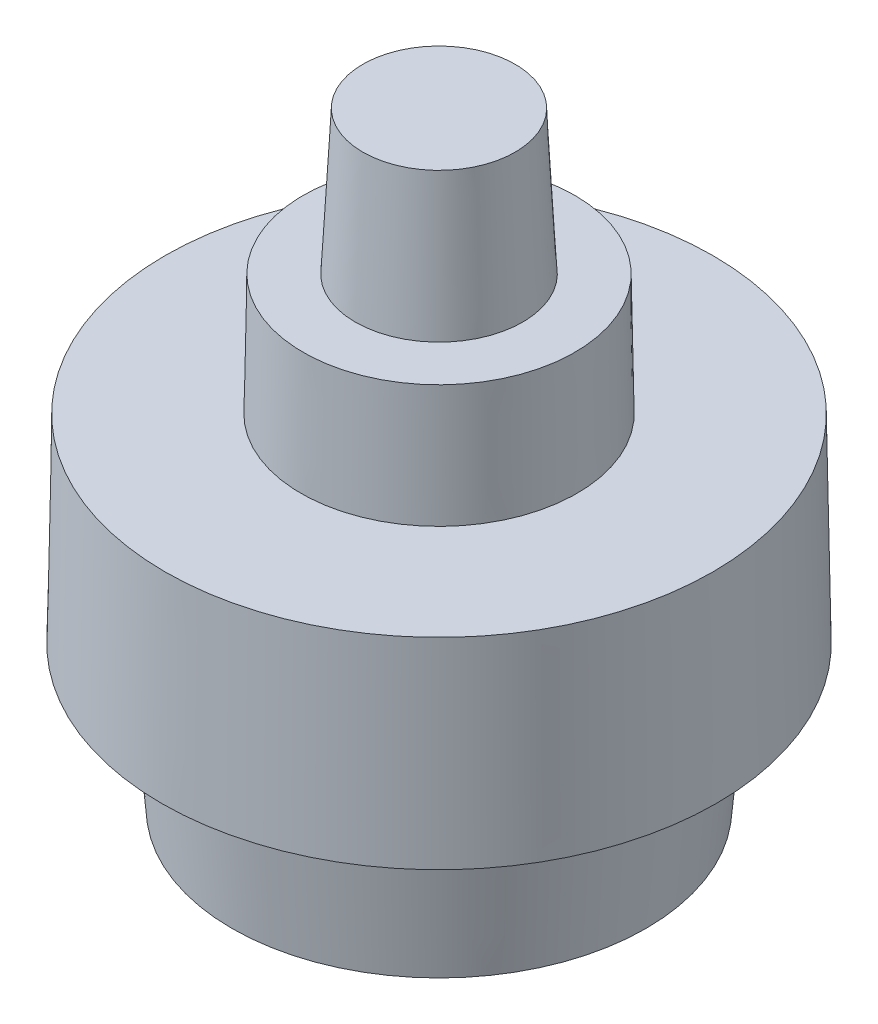
ISO-10303-21;
HEADER;
FILE_DESCRIPTION(('STEP AP214'),'2;1');
FILE_NAME('part.step','',(''),(''),'','','');
FILE_SCHEMA(('AUTOMOTIVE_DESIGN { 1 0 10303 214 1 1 1 1 }'));
ENDSEC;
DATA;
#1=APPLICATION_CONTEXT('core data for automotive mechanical design processes');
#2=APPLICATION_PROTOCOL_DEFINITION('international standard','automotive_design',2000,#1);
#3=PRODUCT_CONTEXT('',#1,'mechanical');
#4=PRODUCT('Part','Part','',(#3));
#5=PRODUCT_RELATED_PRODUCT_CATEGORY('part','',(#4));
#6=PRODUCT_DEFINITION_FORMATION('','',#4);
#7=PRODUCT_DEFINITION_CONTEXT('part definition',#1,'design');
#8=PRODUCT_DEFINITION('design','',#6,#7);
#9=PRODUCT_DEFINITION_SHAPE('','',#8);
#10=(LENGTH_UNIT() NAMED_UNIT(*) SI_UNIT(.MILLI.,.METRE.));
#11=(NAMED_UNIT(*) PLANE_ANGLE_UNIT() SI_UNIT($,.RADIAN.));
#12=(NAMED_UNIT(*) SI_UNIT($,.STERADIAN.) SOLID_ANGLE_UNIT());
#13=UNCERTAINTY_MEASURE_WITH_UNIT(LENGTH_MEASURE(1.E-05),#10,'distance_accuracy_value','');
#14=(GEOMETRIC_REPRESENTATION_CONTEXT(3) GLOBAL_UNCERTAINTY_ASSIGNED_CONTEXT((#13)) GLOBAL_UNIT_ASSIGNED_CONTEXT((#10,
#11,#12)) REPRESENTATION_CONTEXT('',''));
#15=CARTESIAN_POINT('',(0.,0.,0.));
#16=DIRECTION('',(0.,0.,1.));
#17=DIRECTION('',(1.,0.,0.));
#18=AXIS2_PLACEMENT_3D('',#15,#16,#17);
#19=CARTESIAN_POINT('',(0.,-3.4169707634001,0.));
#20=DIRECTION('',(0.,1.,0.));
#21=DIRECTION('',(0.,0.,-1.));
#22=AXIS2_PLACEMENT_3D('',#19,#20,#21);
#23=CONICAL_SURFACE('',#22,45.92,0.0872664625997167);
#24=CARTESIAN_POINT('',(0.,-33.4169707634001,0.));
#25=DIRECTION('',(0.,-1.,0.));
#26=DIRECTION('',(0.,0.,-1.));
#27=AXIS2_PLACEMENT_3D('',#24,#25,#26);
#28=CIRCLE('',#27,43.2953400942223);
#29=CARTESIAN_POINT('',(0.,-33.4169707634001,-43.2953400942223));
#30=VERTEX_POINT('',#29);
#31=EDGE_CURVE('E14',#30,#30,#28,.T.);
#32=ORIENTED_EDGE('',*,*,#31,.F.);
#33=EDGE_LOOP('',(#32));
#34=FACE_BOUND('',#33,.T.);
#35=CARTESIAN_POINT('',(0.,-3.4169707634001,0.));
#36=DIRECTION('',(0.,-1.,0.));
#37=DIRECTION('',(0.,0.,-1.));
#38=AXIS2_PLACEMENT_3D('',#35,#36,#37);
#39=CIRCLE('',#38,45.92);
#40=CARTESIAN_POINT('',(0.,-3.4169707634001,-45.92));
#41=VERTEX_POINT('',#40);
#42=EDGE_CURVE('E64',#41,#41,#39,.T.);
#43=ORIENTED_EDGE('',*,*,#42,.T.);
#44=EDGE_LOOP('',(#43));
#45=FACE_BOUND('',#44,.T.);
#46=ADVANCED_FACE('F58',(#34,#45),#23,.T.);
#47=CARTESIAN_POINT('',(0.,-33.4169707634001,0.));
#48=DIRECTION('',(0.,-1.,0.));
#49=DIRECTION('',(0.,0.,-1.));
#50=AXIS2_PLACEMENT_3D('',#47,#48,#49);
#51=PLANE('',#50);
#52=ORIENTED_EDGE('',*,*,#31,.T.);
#53=EDGE_LOOP('',(#52));
#54=FACE_BOUND('',#53,.T.);
#55=ADVANCED_FACE('F92',(#54),#51,.T.);
#56=CARTESIAN_POINT('',(0.,-3.4169707634001,0.));
#57=DIRECTION('',(0.,-1.,0.));
#58=DIRECTION('',(0.,0.,-1.));
#59=AXIS2_PLACEMENT_3D('',#56,#57,#58);
#60=PLANE('',#59);
#61=CARTESIAN_POINT('',(0.,-3.4169707634001,0.));
#62=DIRECTION('',(0.,-1.,0.));
#63=DIRECTION('',(0.,0.,-1.));
#64=AXIS2_PLACEMENT_3D('',#61,#62,#63);
#65=CIRCLE('',#64,45.7192360324913);
#66=CARTESIAN_POINT('',(0.,-3.4169707634001,-45.7192360324913));
#67=VERTEX_POINT('',#66);
#68=EDGE_CURVE('E72',#67,#67,#65,.T.);
#69=ORIENTED_EDGE('',*,*,#68,.T.);
#70=EDGE_LOOP('',(#69));
#71=FACE_BOUND('',#70,.T.);
#72=ORIENTED_EDGE('',*,*,#42,.F.);
#73=EDGE_LOOP('',(#72));
#74=FACE_BOUND('',#73,.T.);
#75=ADVANCED_FACE('F78',(#71,#74),#60,.F.);
#76=CARTESIAN_POINT('',(0.,-3.39953961485057,0.));
#77=DIRECTION('',(0.,1.,0.));
#78=DIRECTION('',(0.,0.,-1.));
#79=AXIS2_PLACEMENT_3D('',#76,#77,#78);
#80=CONICAL_SURFACE('',#79,45.7207610603817,0.0872664625997167);
#81=CARTESIAN_POINT('',(0.,-33.2169707634001,0.));
#82=DIRECTION('',(0.,-1.,0.));
#83=DIRECTION('',(0.,0.,-1.));
#84=AXIS2_PLACEMENT_3D('',#81,#82,#83);
#85=CIRCLE('',#84,43.1120738594188);
#86=CARTESIAN_POINT('',(0.,-33.2169707634001,-43.1120738594188));
#87=VERTEX_POINT('',#86);
#88=EDGE_CURVE('E68',#87,#87,#85,.T.);
#89=ORIENTED_EDGE('',*,*,#88,.T.);
#90=EDGE_LOOP('',(#89));
#91=FACE_BOUND('',#90,.T.);
#92=ORIENTED_EDGE('',*,*,#68,.F.);
#93=EDGE_LOOP('',(#92));
#94=FACE_BOUND('',#93,.T.);
#95=ADVANCED_FACE('F81',(#91,#94),#80,.F.);
#96=CARTESIAN_POINT('',(0.,-33.2169707634001,0.));
#97=DIRECTION('',(0.,-1.,0.));
#98=DIRECTION('',(0.,0.,-1.));
#99=AXIS2_PLACEMENT_3D('',#96,#97,#98);
#100=PLANE('',#99);
#101=ORIENTED_EDGE('',*,*,#88,.F.);
#102=EDGE_LOOP('',(#101));
#103=FACE_BOUND('',#102,.T.);
#104=ADVANCED_FACE('F83',(#103),#100,.F.);
#105=CLOSED_SHELL('',(#46,#55,#75,#95,#104));
#106=MANIFOLD_SOLID_BREP('B2',#105);
#107=CARTESIAN_POINT('',(0.,63.4830292365999,0.));
#108=DIRECTION('',(0.,-1.,0.));
#109=DIRECTION('',(0.,0.,1.));
#110=AXIS2_PLACEMENT_3D('',#107,#108,#109);
#111=CONICAL_SURFACE('',#110,17.5,0.05235987755983);
#112=CARTESIAN_POINT('',(0.,93.4830292365999,0.));
#113=DIRECTION('',(0.,1.,0.));
#114=DIRECTION('',(0.,0.,1.));
#115=AXIS2_PLACEMENT_3D('',#112,#113,#114);
#116=CIRCLE('',#115,15.9277666215088);
#117=CARTESIAN_POINT('',(0.,93.4830292365999,15.9277666215088));
#118=VERTEX_POINT('',#117);
#119=EDGE_CURVE('E57',#118,#118,#116,.T.);
#120=ORIENTED_EDGE('',*,*,#119,.F.);
#121=EDGE_LOOP('',(#120));
#122=FACE_BOUND('',#121,.T.);
#123=CARTESIAN_POINT('',(0.,63.4830292365999,0.));
#124=DIRECTION('',(0.,1.,0.));
#125=DIRECTION('',(0.,0.,1.));
#126=AXIS2_PLACEMENT_3D('',#123,#124,#125);
#127=CIRCLE('',#126,17.5);
#128=CARTESIAN_POINT('',(0.,63.4830292365999,17.5));
#129=VERTEX_POINT('',#128);
#130=EDGE_CURVE('E153',#129,#129,#127,.T.);
#131=ORIENTED_EDGE('',*,*,#130,.T.);
#132=EDGE_LOOP('',(#131));
#133=FACE_BOUND('',#132,.T.);
#134=ADVANCED_FACE('F147',(#122,#133),#111,.T.);
#135=CARTESIAN_POINT('',(0.,93.4830292365999,0.));
#136=DIRECTION('',(0.,1.,0.));
#137=DIRECTION('',(0.,0.,1.));
#138=AXIS2_PLACEMENT_3D('',#135,#136,#137);
#139=PLANE('',#138);
#140=ORIENTED_EDGE('',*,*,#119,.T.);
#141=EDGE_LOOP('',(#140));
#142=FACE_BOUND('',#141,.T.);
#143=ADVANCED_FACE('F181',(#142),#139,.T.);
#144=CARTESIAN_POINT('',(0.,63.4830292365999,0.));
#145=DIRECTION('',(0.,1.,0.));
#146=DIRECTION('',(0.,0.,1.));
#147=AXIS2_PLACEMENT_3D('',#144,#145,#146);
#148=PLANE('',#147);
#149=CARTESIAN_POINT('',(0.,63.4830292365999,0.));
#150=DIRECTION('',(0.,1.,0.));
#151=DIRECTION('',(0.,0.,1.));
#152=AXIS2_PLACEMENT_3D('',#149,#150,#151);
#153=CIRCLE('',#152,17.2997255308004);
#154=CARTESIAN_POINT('',(0.,63.4830292365999,17.2997255308004));
#155=VERTEX_POINT('',#154);
#156=EDGE_CURVE('E161',#155,#155,#153,.T.);
#157=ORIENTED_EDGE('',*,*,#156,.T.);
#158=EDGE_LOOP('',(#157));
#159=FACE_BOUND('',#158,.T.);
#160=ORIENTED_EDGE('',*,*,#130,.F.);
#161=EDGE_LOOP('',(#160));
#162=FACE_BOUND('',#161,.T.);
#163=ADVANCED_FACE('F167',(#159,#162),#148,.F.);
#164=CARTESIAN_POINT('',(0.,63.4725620453513,0.));
#165=DIRECTION('',(0.,-1.,0.));
#166=DIRECTION('',(0.,0.,1.));
#167=AXIS2_PLACEMENT_3D('',#164,#165,#166);
#168=CONICAL_SURFACE('',#167,17.3002740930491,0.05235987755983);
#169=CARTESIAN_POINT('',(0.,93.2830292365999,0.));
#170=DIRECTION('',(0.,1.,0.));
#171=DIRECTION('',(0.,0.,1.));
#172=AXIS2_PLACEMENT_3D('',#169,#170,#171);
#173=CIRCLE('',#172,15.7379737081658);
#174=CARTESIAN_POINT('',(0.,93.2830292365999,15.7379737081658));
#175=VERTEX_POINT('',#174);
#176=EDGE_CURVE('E157',#175,#175,#173,.T.);
#177=ORIENTED_EDGE('',*,*,#176,.T.);
#178=EDGE_LOOP('',(#177));
#179=FACE_BOUND('',#178,.T.);
#180=ORIENTED_EDGE('',*,*,#156,.F.);
#181=EDGE_LOOP('',(#180));
#182=FACE_BOUND('',#181,.T.);
#183=ADVANCED_FACE('F170',(#179,#182),#168,.F.);
#184=CARTESIAN_POINT('',(0.,93.2830292365999,0.));
#185=DIRECTION('',(0.,1.,0.));
#186=DIRECTION('',(0.,0.,1.));
#187=AXIS2_PLACEMENT_3D('',#184,#185,#186);
#188=PLANE('',#187);
#189=ORIENTED_EDGE('',*,*,#176,.F.);
#190=EDGE_LOOP('',(#189));
#191=FACE_BOUND('',#190,.T.);
#192=ADVANCED_FACE('F172',(#191),#188,.F.);
#193=CLOSED_SHELL('',(#134,#143,#163,#183,#192));
#194=MANIFOLD_SOLID_BREP('B9',#193);
#195=CARTESIAN_POINT('',(0.,94.4786106319487,0.));
#196=DIRECTION('',(0.,1.,0.));
#197=DIRECTION('',(0.,0.,1.));
#198=AXIS2_PLACEMENT_3D('',#195,#196,#197);
#199=CYLINDRICAL_SURFACE('',#198,45.72);
#200=CARTESIAN_POINT('',(0.,-3.4169707634001,0.));
#201=DIRECTION('',(0.,1.,0.));
#202=DIRECTION('',(0.,0.,1.));
#203=AXIS2_PLACEMENT_3D('',#200,#201,#202);
#204=CIRCLE('',#203,45.72);
#205=CARTESIAN_POINT('',(0.,-3.4169707634001,45.72));
#206=VERTEX_POINT('',#205);
#207=EDGE_CURVE('E146',#206,#206,#204,.T.);
#208=ORIENTED_EDGE('',*,*,#207,.F.);
#209=EDGE_LOOP('',(#208));
#210=FACE_BOUND('',#209,.T.);
#211=CARTESIAN_POINT('',(0.,28.0030292365999,0.));
#212=DIRECTION('',(0.,1.,0.));
#213=DIRECTION('',(0.,0.,1.));
#214=AXIS2_PLACEMENT_3D('',#211,#212,#213);
#215=CIRCLE('',#214,45.72);
#216=CARTESIAN_POINT('',(0.,28.0030292365999,45.72));
#217=VERTEX_POINT('',#216);
#218=EDGE_CURVE('E242',#217,#217,#215,.T.);
#219=ORIENTED_EDGE('',*,*,#218,.T.);
#220=EDGE_LOOP('',(#219));
#221=FACE_BOUND('',#220,.T.);
#222=ADVANCED_FACE('F227',(#210,#221),#199,.F.);
#223=CARTESIAN_POINT('',(56.84,-3.4169707634001,0.));
#224=DIRECTION('',(0.,1.,0.));
#225=DIRECTION('',(0.,0.,1.));
#226=AXIS2_PLACEMENT_3D('',#223,#224,#225);
#227=PLANE('',#226);
#228=CARTESIAN_POINT('',(0.,-3.4169707634001,0.));
#229=DIRECTION('',(0.,1.,0.));
#230=DIRECTION('',(0.,0.,1.));
#231=AXIS2_PLACEMENT_3D('',#228,#229,#230);
#232=CIRCLE('',#231,58.0077438436978);
#233=CARTESIAN_POINT('',(0.,-3.4169707634001,58.0077438436978));
#234=VERTEX_POINT('',#233);
#235=EDGE_CURVE('E235',#234,#234,#232,.T.);
#236=ORIENTED_EDGE('',*,*,#235,.F.);
#237=EDGE_LOOP('',(#236));
#238=FACE_BOUND('',#237,.T.);
#239=ORIENTED_EDGE('',*,*,#207,.T.);
#240=EDGE_LOOP('',(#239));
#241=FACE_BOUND('',#240,.T.);
#242=ADVANCED_FACE('F271',(#238,#241),#227,.F.);
#243=CARTESIAN_POINT('',(0.,63.4830292365999,0.));
#244=DIRECTION('',(0.,-1.,0.));
#245=DIRECTION('',(0.,0.,1.));
#246=AXIS2_PLACEMENT_3D('',#243,#244,#245);
#247=CONICAL_SURFACE('',#246,56.84,0.0174532925199433);
#248=CARTESIAN_POINT('',(0.,38.1530292365999,0.));
#249=DIRECTION('',(0.,-1.,0.));
#250=DIRECTION('',(0.,0.,-1.));
#251=AXIS2_PLACEMENT_3D('',#248,#249,#250);
#252=CIRCLE('',#251,57.2821367946317);
#253=CARTESIAN_POINT('',(0.,38.1530292365999,-57.2821367946317));
#254=VERTEX_POINT('',#253);
#255=EDGE_CURVE('E240',#254,#254,#252,.F.);
#256=ORIENTED_EDGE('',*,*,#255,.F.);
#257=EDGE_LOOP('',(#256));
#258=FACE_BOUND('',#257,.T.);
#259=ORIENTED_EDGE('',*,*,#235,.T.);
#260=EDGE_LOOP('',(#259));
#261=FACE_BOUND('',#260,.T.);
#262=ADVANCED_FACE('F263',(#258,#261),#247,.T.);
#263=CARTESIAN_POINT('',(56.84,38.1530292365999,0.));
#264=DIRECTION('',(0.,-1.,0.));
#265=DIRECTION('',(0.,0.,-1.));
#266=AXIS2_PLACEMENT_3D('',#263,#264,#265);
#267=PLANE('',#266);
#268=CARTESIAN_POINT('',(0.,38.1530292365999,0.));
#269=DIRECTION('',(0.,-1.,0.));
#270=DIRECTION('',(0.,0.,-1.));
#271=AXIS2_PLACEMENT_3D('',#268,#269,#270);
#272=CIRCLE('',#271,28.8621367946318);
#273=CARTESIAN_POINT('',(0.,38.1530292365999,-28.8621367946318));
#274=VERTEX_POINT('',#273);
#275=EDGE_CURVE('E231',#274,#274,#272,.F.);
#276=ORIENTED_EDGE('',*,*,#275,.F.);
#277=EDGE_LOOP('',(#276));
#278=FACE_BOUND('',#277,.T.);
#279=ORIENTED_EDGE('',*,*,#255,.T.);
#280=EDGE_LOOP('',(#279));
#281=FACE_BOUND('',#280,.T.);
#282=ADVANCED_FACE('F261',(#278,#281),#267,.F.);
#283=CARTESIAN_POINT('',(0.,63.4830292365999,0.));
#284=DIRECTION('',(0.,-1.,0.));
#285=DIRECTION('',(0.,0.,1.));
#286=AXIS2_PLACEMENT_3D('',#283,#284,#285);
#287=CONICAL_SURFACE('',#286,28.42,0.0174532925199433);
#288=CARTESIAN_POINT('',(0.,63.4830292365999,0.));
#289=DIRECTION('',(0.,-1.,0.));
#290=DIRECTION('',(0.,0.,-1.));
#291=AXIS2_PLACEMENT_3D('',#288,#289,#290);
#292=CIRCLE('',#291,28.42);
#293=CARTESIAN_POINT('',(0.,63.4830292365999,-28.42));
#294=VERTEX_POINT('',#293);
#295=EDGE_CURVE('E249',#294,#294,#292,.F.);
#296=ORIENTED_EDGE('',*,*,#295,.F.);
#297=EDGE_LOOP('',(#296));
#298=FACE_BOUND('',#297,.T.);
#299=ORIENTED_EDGE('',*,*,#275,.T.);
#300=EDGE_LOOP('',(#299));
#301=FACE_BOUND('',#300,.T.);
#302=ADVANCED_FACE('F229',(#298,#301),#287,.T.);
#303=CARTESIAN_POINT('',(28.42,63.4830292365999,0.));
#304=DIRECTION('',(0.,-1.,0.));
#305=DIRECTION('',(0.,0.,-1.));
#306=AXIS2_PLACEMENT_3D('',#303,#304,#305);
#307=PLANE('',#306);
#308=CARTESIAN_POINT('',(0.,63.4830292365999,0.));
#309=DIRECTION('',(0.,-1.,0.));
#310=DIRECTION('',(0.,0.,-1.));
#311=AXIS2_PLACEMENT_3D('',#308,#309,#310);
#312=CIRCLE('',#311,17.3);
#313=CARTESIAN_POINT('',(0.,63.4830292365999,-17.3));
#314=VERTEX_POINT('',#313);
#315=EDGE_CURVE('E246',#314,#314,#312,.F.);
#316=ORIENTED_EDGE('',*,*,#315,.F.);
#317=EDGE_LOOP('',(#316));
#318=FACE_BOUND('',#317,.T.);
#319=ORIENTED_EDGE('',*,*,#295,.T.);
#320=EDGE_LOOP('',(#319));
#321=FACE_BOUND('',#320,.T.);
#322=ADVANCED_FACE('F269',(#318,#321),#307,.F.);
#323=CARTESIAN_POINT('',(0.,94.4786106319487,0.));
#324=DIRECTION('',(0.,1.,0.));
#325=DIRECTION('',(0.,0.,1.));
#326=AXIS2_PLACEMENT_3D('',#323,#324,#325);
#327=CYLINDRICAL_SURFACE('',#326,17.3);
#328=CARTESIAN_POINT('',(0.,28.0030292365999,0.));
#329=DIRECTION('',(0.,1.,0.));
#330=DIRECTION('',(0.,0.,1.));
#331=AXIS2_PLACEMENT_3D('',#328,#329,#330);
#332=CIRCLE('',#331,17.3);
#333=CARTESIAN_POINT('',(0.,28.0030292365999,17.3));
#334=VERTEX_POINT('',#333);
#335=EDGE_CURVE('E245',#334,#334,#332,.T.);
#336=ORIENTED_EDGE('',*,*,#335,.F.);
#337=EDGE_LOOP('',(#336));
#338=FACE_BOUND('',#337,.T.);
#339=ORIENTED_EDGE('',*,*,#315,.T.);
#340=EDGE_LOOP('',(#339));
#341=FACE_BOUND('',#340,.T.);
#342=ADVANCED_FACE('F284',(#338,#341),#327,.F.);
#343=CARTESIAN_POINT('',(48.72,28.0030292365999,0.));
#344=DIRECTION('',(0.,1.,0.));
#345=DIRECTION('',(0.,0.,1.));
#346=AXIS2_PLACEMENT_3D('',#343,#344,#345);
#347=PLANE('',#346);
#348=ORIENTED_EDGE('',*,*,#218,.F.);
#349=EDGE_LOOP('',(#348));
#350=FACE_BOUND('',#349,.T.);
#351=ORIENTED_EDGE('',*,*,#335,.T.);
#352=EDGE_LOOP('',(#351));
#353=FACE_BOUND('',#352,.T.);
#354=ADVANCED_FACE('F287',(#350,#353),#347,.F.);
#355=CLOSED_SHELL('',(#222,#242,#262,#282,#302,#322,#342,#354));
#356=MANIFOLD_SOLID_BREP('B52',#355);
#357=ADVANCED_BREP_SHAPE_REPRESENTATION('',(#18,#106,#194,#356),#14);
#358=SHAPE_DEFINITION_REPRESENTATION(#9,#357);
ENDSEC;
END-ISO-10303-21;
